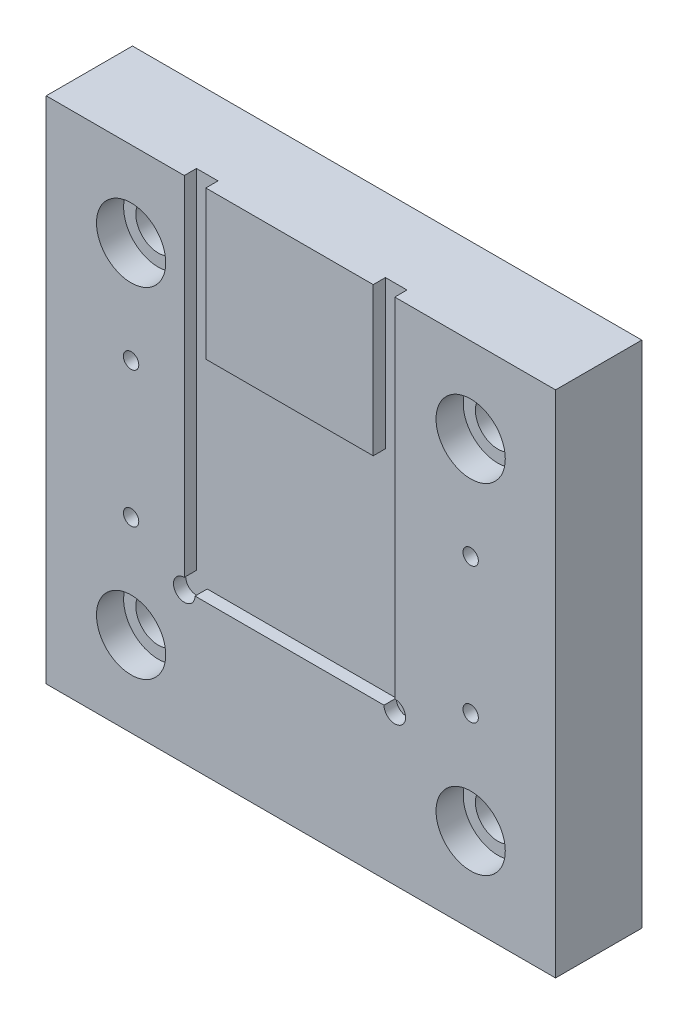
ISO-10303-21;
HEADER;
FILE_DESCRIPTION(('STEP AP214'),'2;1');
FILE_NAME('part.step','',(''),(''),'','','');
FILE_SCHEMA(('AUTOMOTIVE_DESIGN { 1 0 10303 214 1 1 1 1 }'));
ENDSEC;
DATA;
#1=APPLICATION_CONTEXT('core data for automotive mechanical design processes');
#2=APPLICATION_PROTOCOL_DEFINITION('international standard','automotive_design',2000,#1);
#3=PRODUCT_CONTEXT('',#1,'mechanical');
#4=PRODUCT('Part','Part','',(#3));
#5=PRODUCT_RELATED_PRODUCT_CATEGORY('part','',(#4));
#6=PRODUCT_DEFINITION_FORMATION('','',#4);
#7=PRODUCT_DEFINITION_CONTEXT('part definition',#1,'design');
#8=PRODUCT_DEFINITION('design','',#6,#7);
#9=PRODUCT_DEFINITION_SHAPE('','',#8);
#10=(LENGTH_UNIT() NAMED_UNIT(*) SI_UNIT(.MILLI.,.METRE.));
#11=(NAMED_UNIT(*) PLANE_ANGLE_UNIT() SI_UNIT($,.RADIAN.));
#12=(NAMED_UNIT(*) SI_UNIT($,.STERADIAN.) SOLID_ANGLE_UNIT());
#13=UNCERTAINTY_MEASURE_WITH_UNIT(LENGTH_MEASURE(1.E-05),#10,'distance_accuracy_value','');
#14=(GEOMETRIC_REPRESENTATION_CONTEXT(3) GLOBAL_UNCERTAINTY_ASSIGNED_CONTEXT((#13)) GLOBAL_UNIT_ASSIGNED_CONTEXT((#10,
#11,#12)) REPRESENTATION_CONTEXT('',''));
#15=CARTESIAN_POINT('',(0.,0.,0.));
#16=DIRECTION('',(0.,0.,1.));
#17=DIRECTION('',(1.,0.,0.));
#18=AXIS2_PLACEMENT_3D('',#15,#16,#17);
#19=CARTESIAN_POINT('',(0.,0.,12.7));
#20=DIRECTION('',(0.,0.,1.));
#21=DIRECTION('',(1.,0.,0.));
#22=AXIS2_PLACEMENT_3D('',#19,#20,#21);
#23=PLANE('',#22);
#24=DIRECTION('',(0.,1.,0.));
#25=VECTOR('',#24,1.);
#26=CARTESIAN_POINT('',(-49.6638269453301,39.1940373937284,12.7));
#27=LINE('',#26,#25);
#28=CARTESIAN_POINT('',(-49.6638269453301,39.1940373937284,12.7));
#29=VERTEX_POINT('',#28);
#30=CARTESIAN_POINT('',(-49.6638269453301,61.0294730285758,12.7));
#31=VERTEX_POINT('',#30);
#32=EDGE_CURVE('E155',#29,#31,#27,.T.);
#33=ORIENTED_EDGE('',*,*,#32,.F.);
#34=DIRECTION('',(-1.,0.,0.));
#35=VECTOR('',#34,1.);
#36=CARTESIAN_POINT('',(-49.6638269453301,39.1940373937284,12.7));
#37=LINE('',#36,#35);
#38=CARTESIAN_POINT('',(-25.0138269453301,39.1940373937284,12.7));
#39=VERTEX_POINT('',#38);
#40=EDGE_CURVE('E202',#39,#29,#37,.T.);
#41=ORIENTED_EDGE('',*,*,#40,.F.);
#42=DIRECTION('',(0.,-1.,0.));
#43=VECTOR('',#42,1.);
#44=CARTESIAN_POINT('',(-25.0138269453301,39.1940373937284,12.7));
#45=LINE('',#44,#43);
#46=CARTESIAN_POINT('',(-25.0138269453301,61.0294730285758,12.7));
#47=VERTEX_POINT('',#46);
#48=EDGE_CURVE('E199',#47,#39,#45,.T.);
#49=ORIENTED_EDGE('',*,*,#48,.F.);
#50=DIRECTION('',(-1.,0.,0.));
#51=VECTOR('',#50,1.);
#52=CARTESIAN_POINT('',(-73.1661572798309,61.0294730285758,12.7));
#53=LINE('',#52,#51);
#54=EDGE_CURVE('E293',#47,#31,#53,.T.);
#55=ORIENTED_EDGE('',*,*,#54,.T.);
#56=EDGE_LOOP('',(#33,#41,#49,#55));
#57=FACE_BOUND('',#56,.T.);
#58=ADVANCED_FACE('F32',(#57),#23,.T.);
#59=CARTESIAN_POINT('',(-10.6661572798309,-1.47052697142425,12.7));
#60=DIRECTION('',(0.,0.,-1.));
#61=DIRECTION('',(-1.,0.,0.));
#62=AXIS2_PLACEMENT_3D('',#59,#60,#61);
#63=CYLINDRICAL_SURFACE('',#62,3.3);
#64=CARTESIAN_POINT('',(-10.6661572798309,-1.47052697142425,0.));
#65=DIRECTION('',(0.,0.,1.));
#66=DIRECTION('',(1.,0.,0.));
#67=AXIS2_PLACEMENT_3D('',#64,#65,#66);
#68=CIRCLE('',#67,3.3);
#69=CARTESIAN_POINT('',(-7.36615727983086,-1.47052697142425,0.));
#70=VERTEX_POINT('',#69);
#71=EDGE_CURVE('E281',#70,#70,#68,.T.);
#72=ORIENTED_EDGE('',*,*,#71,.F.);
#73=EDGE_LOOP('',(#72));
#74=FACE_BOUND('',#73,.T.);
#75=CARTESIAN_POINT('',(-10.6661572798309,-1.47052697142425,8.7));
#76=DIRECTION('',(0.,0.,1.));
#77=DIRECTION('',(1.,0.,0.));
#78=AXIS2_PLACEMENT_3D('',#75,#76,#77);
#79=CIRCLE('',#78,3.3);
#80=CARTESIAN_POINT('',(-7.36615727983086,-1.47052697142425,8.7));
#81=VERTEX_POINT('',#80);
#82=EDGE_CURVE('E36',#81,#81,#79,.T.);
#83=ORIENTED_EDGE('',*,*,#82,.T.);
#84=EDGE_LOOP('',(#83));
#85=FACE_BOUND('',#84,.T.);
#86=ADVANCED_FACE('F368',(#74,#85),#63,.F.);
#87=CARTESIAN_POINT('',(-60.6661572798309,-1.47052697142424,12.7));
#88=DIRECTION('',(0.,0.,-1.));
#89=DIRECTION('',(-1.,0.,0.));
#90=AXIS2_PLACEMENT_3D('',#87,#88,#89);
#91=CYLINDRICAL_SURFACE('',#90,3.3);
#92=CARTESIAN_POINT('',(-60.6661572798309,-1.47052697142424,0.));
#93=DIRECTION('',(0.,0.,1.));
#94=DIRECTION('',(1.,0.,0.));
#95=AXIS2_PLACEMENT_3D('',#92,#93,#94);
#96=CIRCLE('',#95,3.3);
#97=CARTESIAN_POINT('',(-57.3661572798309,-1.47052697142424,0.));
#98=VERTEX_POINT('',#97);
#99=EDGE_CURVE('E284',#98,#98,#96,.T.);
#100=ORIENTED_EDGE('',*,*,#99,.F.);
#101=EDGE_LOOP('',(#100));
#102=FACE_BOUND('',#101,.T.);
#103=CARTESIAN_POINT('',(-60.6661572798309,-1.47052697142424,8.7));
#104=DIRECTION('',(0.,0.,1.));
#105=DIRECTION('',(1.,0.,0.));
#106=AXIS2_PLACEMENT_3D('',#103,#104,#105);
#107=CIRCLE('',#106,3.3);
#108=CARTESIAN_POINT('',(-57.3661572798309,-1.47052697142424,8.7));
#109=VERTEX_POINT('',#108);
#110=EDGE_CURVE('E233',#109,#109,#107,.T.);
#111=ORIENTED_EDGE('',*,*,#110,.T.);
#112=EDGE_LOOP('',(#111));
#113=FACE_BOUND('',#112,.T.);
#114=ADVANCED_FACE('F315',(#102,#113),#91,.F.);
#115=CARTESIAN_POINT('',(-10.6661572798309,48.5294730285758,12.7));
#116=DIRECTION('',(0.,0.,-1.));
#117=DIRECTION('',(-1.,0.,0.));
#118=AXIS2_PLACEMENT_3D('',#115,#116,#117);
#119=CYLINDRICAL_SURFACE('',#118,3.3);
#120=CARTESIAN_POINT('',(-10.6661572798309,48.5294730285758,0.));
#121=DIRECTION('',(0.,0.,1.));
#122=DIRECTION('',(1.,0.,0.));
#123=AXIS2_PLACEMENT_3D('',#120,#121,#122);
#124=CIRCLE('',#123,3.3);
#125=CARTESIAN_POINT('',(-7.36615727983088,48.5294730285758,0.));
#126=VERTEX_POINT('',#125);
#127=EDGE_CURVE('E278',#126,#126,#124,.T.);
#128=ORIENTED_EDGE('',*,*,#127,.F.);
#129=EDGE_LOOP('',(#128));
#130=FACE_BOUND('',#129,.T.);
#131=CARTESIAN_POINT('',(-10.6661572798309,48.5294730285758,8.7));
#132=DIRECTION('',(0.,0.,1.));
#133=DIRECTION('',(1.,0.,0.));
#134=AXIS2_PLACEMENT_3D('',#131,#132,#133);
#135=CIRCLE('',#134,3.3);
#136=CARTESIAN_POINT('',(-7.36615727983088,48.5294730285758,8.7));
#137=VERTEX_POINT('',#136);
#138=EDGE_CURVE('E240',#137,#137,#135,.T.);
#139=ORIENTED_EDGE('',*,*,#138,.T.);
#140=EDGE_LOOP('',(#139));
#141=FACE_BOUND('',#140,.T.);
#142=ADVANCED_FACE('F378',(#130,#141),#119,.F.);
#143=CARTESIAN_POINT('',(-60.6661572798309,48.5294730285758,12.7));
#144=DIRECTION('',(0.,0.,-1.));
#145=DIRECTION('',(-1.,0.,0.));
#146=AXIS2_PLACEMENT_3D('',#143,#144,#145);
#147=CYLINDRICAL_SURFACE('',#146,3.29999999999999);
#148=CARTESIAN_POINT('',(-60.6661572798309,48.5294730285758,0.));
#149=DIRECTION('',(0.,0.,1.));
#150=DIRECTION('',(1.,0.,0.));
#151=AXIS2_PLACEMENT_3D('',#148,#149,#150);
#152=CIRCLE('',#151,3.29999999999999);
#153=CARTESIAN_POINT('',(-57.3661572798309,48.5294730285758,0.));
#154=VERTEX_POINT('',#153);
#155=EDGE_CURVE('E273',#154,#154,#152,.T.);
#156=ORIENTED_EDGE('',*,*,#155,.F.);
#157=EDGE_LOOP('',(#156));
#158=FACE_BOUND('',#157,.T.);
#159=CARTESIAN_POINT('',(-60.6661572798309,48.5294730285758,8.7));
#160=DIRECTION('',(0.,0.,1.));
#161=DIRECTION('',(1.,0.,0.));
#162=AXIS2_PLACEMENT_3D('',#159,#160,#161);
#163=CIRCLE('',#162,3.29999999999999);
#164=CARTESIAN_POINT('',(-57.3661572798309,48.5294730285758,8.7));
#165=VERTEX_POINT('',#164);
#166=EDGE_CURVE('E247',#165,#165,#163,.T.);
#167=ORIENTED_EDGE('',*,*,#166,.T.);
#168=EDGE_LOOP('',(#167));
#169=FACE_BOUND('',#168,.T.);
#170=ADVANCED_FACE('F335',(#158,#169),#147,.F.);
#171=DIRECTION('',(0.,1.,0.));
#172=VECTOR('',#171,1.);
#173=CARTESIAN_POINT('',(-21.8388269453301,39.1940373937284,12.7));
#174=LINE('',#173,#172);
#175=CARTESIAN_POINT('',(-21.8388269453301,9.78153739372838,12.7));
#176=VERTEX_POINT('',#175);
#177=CARTESIAN_POINT('',(-21.8388269453301,61.0294730285758,12.7));
#178=VERTEX_POINT('',#177);
#179=EDGE_CURVE('E197',#176,#178,#174,.T.);
#180=ORIENTED_EDGE('',*,*,#179,.F.);
#181=CARTESIAN_POINT('',(-21.8388269453301,8.19403739372838,12.7));
#182=DIRECTION('',(0.,0.,1.));
#183=DIRECTION('',(1.,0.,0.));
#184=AXIS2_PLACEMENT_3D('',#181,#182,#183);
#185=CIRCLE('',#184,1.5875);
#186=CARTESIAN_POINT('',(-23.4263269453301,8.19403739372838,12.7));
#187=VERTEX_POINT('',#186);
#188=EDGE_CURVE('E194',#187,#176,#185,.T.);
#189=ORIENTED_EDGE('',*,*,#188,.F.);
#190=DIRECTION('',(1.,0.,0.));
#191=VECTOR('',#190,1.);
#192=CARTESIAN_POINT('',(-51.2513269453301,8.19403739372838,12.7));
#193=LINE('',#192,#191);
#194=CARTESIAN_POINT('',(-51.2513269453301,8.19403739372838,12.7));
#195=VERTEX_POINT('',#194);
#196=EDGE_CURVE('E191',#195,#187,#193,.T.);
#197=ORIENTED_EDGE('',*,*,#196,.F.);
#198=CARTESIAN_POINT('',(-52.8388269453301,8.19403739372838,12.7));
#199=DIRECTION('',(0.,0.,1.));
#200=DIRECTION('',(1.,0.,0.));
#201=AXIS2_PLACEMENT_3D('',#198,#199,#200);
#202=CIRCLE('',#201,1.5875);
#203=CARTESIAN_POINT('',(-52.8388269453301,9.78153739372838,12.7));
#204=VERTEX_POINT('',#203);
#205=EDGE_CURVE('E189',#204,#195,#202,.T.);
#206=ORIENTED_EDGE('',*,*,#205,.F.);
#207=DIRECTION('',(0.,-1.,0.));
#208=VECTOR('',#207,1.);
#209=CARTESIAN_POINT('',(-52.8388269453301,39.1940373937284,12.7));
#210=LINE('',#209,#208);
#211=CARTESIAN_POINT('',(-52.8388269453301,61.0294730285758,12.7));
#212=VERTEX_POINT('',#211);
#213=EDGE_CURVE('E161',#212,#204,#210,.T.);
#214=ORIENTED_EDGE('',*,*,#213,.F.);
#215=CARTESIAN_POINT('',(-73.1661572798309,61.0294730285758,12.7));
#216=VERTEX_POINT('',#215);
#217=EDGE_CURVE('E290',#212,#216,#53,.T.);
#218=ORIENTED_EDGE('',*,*,#217,.T.);
#219=DIRECTION('',(0.,-1.,0.));
#220=VECTOR('',#219,1.);
#221=CARTESIAN_POINT('',(-73.1661572798309,61.0294730285758,12.7));
#222=LINE('',#221,#220);
#223=CARTESIAN_POINT('',(-73.1661572798309,-13.9705269714242,12.7));
#224=VERTEX_POINT('',#223);
#225=EDGE_CURVE('E292',#216,#224,#222,.T.);
#226=ORIENTED_EDGE('',*,*,#225,.T.);
#227=DIRECTION('',(1.,0.,0.));
#228=VECTOR('',#227,1.);
#229=CARTESIAN_POINT('',(-73.1661572798309,-13.9705269714242,12.7));
#230=LINE('',#229,#228);
#231=CARTESIAN_POINT('',(1.83384272016913,-13.9705269714242,12.7));
#232=VERTEX_POINT('',#231);
#233=EDGE_CURVE('E58',#224,#232,#230,.T.);
#234=ORIENTED_EDGE('',*,*,#233,.T.);
#235=DIRECTION('',(0.,1.,0.));
#236=VECTOR('',#235,1.);
#237=CARTESIAN_POINT('',(1.83384272016912,61.0294730285758,12.7));
#238=LINE('',#237,#236);
#239=CARTESIAN_POINT('',(1.83384272016912,61.0294730285758,12.7));
#240=VERTEX_POINT('',#239);
#241=EDGE_CURVE('E288',#232,#240,#238,.T.);
#242=ORIENTED_EDGE('',*,*,#241,.T.);
#243=EDGE_CURVE('E86',#240,#178,#53,.T.);
#244=ORIENTED_EDGE('',*,*,#243,.T.);
#245=EDGE_LOOP('',(#180,#189,#197,#206,#214,#218,#226,#234,#242,#244));
#246=FACE_BOUND('',#245,.T.);
#247=CARTESIAN_POINT('',(-10.6661572798309,-1.47052697142425,12.7));
#248=DIRECTION('',(0.,0.,1.));
#249=DIRECTION('',(1.,0.,0.));
#250=AXIS2_PLACEMENT_3D('',#247,#248,#249);
#251=CIRCLE('',#250,5.1);
#252=CARTESIAN_POINT('',(-5.56615727983086,-1.47052697142425,12.7));
#253=VERTEX_POINT('',#252);
#254=EDGE_CURVE('E208',#253,#253,#251,.T.);
#255=ORIENTED_EDGE('',*,*,#254,.F.);
#256=EDGE_LOOP('',(#255));
#257=FACE_BOUND('',#256,.T.);
#258=CARTESIAN_POINT('',(-60.6661572798309,-1.47052697142424,12.7));
#259=DIRECTION('',(0.,0.,1.));
#260=DIRECTION('',(1.,0.,0.));
#261=AXIS2_PLACEMENT_3D('',#258,#259,#260);
#262=CIRCLE('',#261,5.1);
#263=CARTESIAN_POINT('',(-55.5661572798309,-1.47052697142424,12.7));
#264=VERTEX_POINT('',#263);
#265=EDGE_CURVE('E234',#264,#264,#262,.T.);
#266=ORIENTED_EDGE('',*,*,#265,.F.);
#267=EDGE_LOOP('',(#266));
#268=FACE_BOUND('',#267,.T.);
#269=CARTESIAN_POINT('',(-10.6661572798309,48.5294730285758,12.7));
#270=DIRECTION('',(0.,0.,1.));
#271=DIRECTION('',(1.,0.,0.));
#272=AXIS2_PLACEMENT_3D('',#269,#270,#271);
#273=CIRCLE('',#272,5.1);
#274=CARTESIAN_POINT('',(-5.56615727983088,48.5294730285758,12.7));
#275=VERTEX_POINT('',#274);
#276=EDGE_CURVE('E241',#275,#275,#273,.T.);
#277=ORIENTED_EDGE('',*,*,#276,.F.);
#278=EDGE_LOOP('',(#277));
#279=FACE_BOUND('',#278,.T.);
#280=CARTESIAN_POINT('',(-60.6661572798309,48.5294730285758,12.7));
#281=DIRECTION('',(0.,0.,1.));
#282=DIRECTION('',(1.,0.,0.));
#283=AXIS2_PLACEMENT_3D('',#280,#281,#282);
#284=CIRCLE('',#283,5.1);
#285=CARTESIAN_POINT('',(-55.5661572798309,48.5294730285758,12.7));
#286=VERTEX_POINT('',#285);
#287=EDGE_CURVE('E248',#286,#286,#284,.T.);
#288=ORIENTED_EDGE('',*,*,#287,.F.);
#289=EDGE_LOOP('',(#288));
#290=FACE_BOUND('',#289,.T.);
#291=CARTESIAN_POINT('',(-60.6661572798309,13.5294730285758,12.7));
#292=DIRECTION('',(0.,0.,1.));
#293=DIRECTION('',(1.,0.,0.));
#294=AXIS2_PLACEMENT_3D('',#291,#292,#293);
#295=CIRCLE('',#294,1.1303);
#296=CARTESIAN_POINT('',(-59.5358572798309,13.5294730285758,12.7));
#297=VERTEX_POINT('',#296);
#298=EDGE_CURVE('E258',#297,#297,#295,.T.);
#299=ORIENTED_EDGE('',*,*,#298,.F.);
#300=EDGE_LOOP('',(#299));
#301=FACE_BOUND('',#300,.T.);
#302=CARTESIAN_POINT('',(-60.6661572798309,33.5294730285758,12.7));
#303=DIRECTION('',(0.,0.,1.));
#304=DIRECTION('',(1.,0.,0.));
#305=AXIS2_PLACEMENT_3D('',#302,#303,#304);
#306=CIRCLE('',#305,1.1303);
#307=CARTESIAN_POINT('',(-59.5358572798309,33.5294730285758,12.7));
#308=VERTEX_POINT('',#307);
#309=EDGE_CURVE('E270',#308,#308,#306,.T.);
#310=ORIENTED_EDGE('',*,*,#309,.F.);
#311=EDGE_LOOP('',(#310));
#312=FACE_BOUND('',#311,.T.);
#313=CARTESIAN_POINT('',(-10.6661572798309,33.5294730285758,12.7));
#314=DIRECTION('',(0.,0.,1.));
#315=DIRECTION('',(1.,0.,0.));
#316=AXIS2_PLACEMENT_3D('',#313,#314,#315);
#317=CIRCLE('',#316,1.1303);
#318=CARTESIAN_POINT('',(-9.53585727983087,33.5294730285758,12.7));
#319=VERTEX_POINT('',#318);
#320=EDGE_CURVE('E264',#319,#319,#317,.T.);
#321=ORIENTED_EDGE('',*,*,#320,.F.);
#322=EDGE_LOOP('',(#321));
#323=FACE_BOUND('',#322,.T.);
#324=CARTESIAN_POINT('',(-10.6661572798309,13.5294730285758,12.7));
#325=DIRECTION('',(0.,0.,1.));
#326=DIRECTION('',(1.,0.,0.));
#327=AXIS2_PLACEMENT_3D('',#324,#325,#326);
#328=CIRCLE('',#327,1.1303);
#329=CARTESIAN_POINT('',(-9.53585727983087,13.5294730285758,12.7));
#330=VERTEX_POINT('',#329);
#331=EDGE_CURVE('E251',#330,#330,#328,.T.);
#332=ORIENTED_EDGE('',*,*,#331,.F.);
#333=EDGE_LOOP('',(#332));
#334=FACE_BOUND('',#333,.T.);
#335=ADVANCED_FACE('F331',(#246,#257,#268,#279,#290,#301,#312,#323,#334),#23,.T.);
#336=CARTESIAN_POINT('',(0.,0.,0.));
#337=DIRECTION('',(0.,0.,1.));
#338=DIRECTION('',(1.,0.,0.));
#339=AXIS2_PLACEMENT_3D('',#336,#337,#338);
#340=PLANE('',#339);
#341=CARTESIAN_POINT('',(-60.6661572798309,13.5294730285758,0.));
#342=DIRECTION('',(0.,0.,1.));
#343=DIRECTION('',(1.,0.,0.));
#344=AXIS2_PLACEMENT_3D('',#341,#342,#343);
#345=CIRCLE('',#344,1.1303);
#346=CARTESIAN_POINT('',(-59.5358572798309,13.5294730285758,0.));
#347=VERTEX_POINT('',#346);
#348=EDGE_CURVE('E254',#347,#347,#345,.T.);
#349=ORIENTED_EDGE('',*,*,#348,.T.);
#350=EDGE_LOOP('',(#349));
#351=FACE_BOUND('',#350,.T.);
#352=CARTESIAN_POINT('',(-60.6661572798309,33.5294730285758,0.));
#353=DIRECTION('',(0.,0.,1.));
#354=DIRECTION('',(1.,0.,0.));
#355=AXIS2_PLACEMENT_3D('',#352,#353,#354);
#356=CIRCLE('',#355,1.1303);
#357=CARTESIAN_POINT('',(-59.5358572798309,33.5294730285758,0.));
#358=VERTEX_POINT('',#357);
#359=EDGE_CURVE('E267',#358,#358,#356,.T.);
#360=ORIENTED_EDGE('',*,*,#359,.T.);
#361=EDGE_LOOP('',(#360));
#362=FACE_BOUND('',#361,.T.);
#363=ORIENTED_EDGE('',*,*,#127,.T.);
#364=EDGE_LOOP('',(#363));
#365=FACE_BOUND('',#364,.T.);
#366=ORIENTED_EDGE('',*,*,#99,.T.);
#367=EDGE_LOOP('',(#366));
#368=FACE_BOUND('',#367,.T.);
#369=DIRECTION('',(0.,1.,0.));
#370=VECTOR('',#369,1.);
#371=CARTESIAN_POINT('',(1.83384272016912,61.0294730285758,0.));
#372=LINE('',#371,#370);
#373=CARTESIAN_POINT('',(1.83384272016913,-13.9705269714242,0.));
#374=VERTEX_POINT('',#373);
#375=CARTESIAN_POINT('',(1.83384272016912,61.0294730285758,0.));
#376=VERTEX_POINT('',#375);
#377=EDGE_CURVE('E287',#374,#376,#372,.T.);
#378=ORIENTED_EDGE('',*,*,#377,.F.);
#379=DIRECTION('',(1.,0.,0.));
#380=VECTOR('',#379,1.);
#381=CARTESIAN_POINT('',(-73.1661572798309,-13.9705269714242,0.));
#382=LINE('',#381,#380);
#383=CARTESIAN_POINT('',(-73.1661572798309,-13.9705269714242,0.));
#384=VERTEX_POINT('',#383);
#385=EDGE_CURVE('E79',#384,#374,#382,.T.);
#386=ORIENTED_EDGE('',*,*,#385,.F.);
#387=DIRECTION('',(0.,-1.,0.));
#388=VECTOR('',#387,1.);
#389=CARTESIAN_POINT('',(-73.1661572798309,61.0294730285758,0.));
#390=LINE('',#389,#388);
#391=CARTESIAN_POINT('',(-73.1661572798309,61.0294730285758,0.));
#392=VERTEX_POINT('',#391);
#393=EDGE_CURVE('E301',#392,#384,#390,.T.);
#394=ORIENTED_EDGE('',*,*,#393,.F.);
#395=DIRECTION('',(-1.,0.,0.));
#396=VECTOR('',#395,1.);
#397=CARTESIAN_POINT('',(-73.1661572798309,61.0294730285758,0.));
#398=LINE('',#397,#396);
#399=EDGE_CURVE('E299',#376,#392,#398,.T.);
#400=ORIENTED_EDGE('',*,*,#399,.F.);
#401=EDGE_LOOP('',(#378,#386,#394,#400));
#402=FACE_BOUND('',#401,.T.);
#403=ORIENTED_EDGE('',*,*,#71,.T.);
#404=EDGE_LOOP('',(#403));
#405=FACE_BOUND('',#404,.T.);
#406=ORIENTED_EDGE('',*,*,#155,.T.);
#407=EDGE_LOOP('',(#406));
#408=FACE_BOUND('',#407,.T.);
#409=CARTESIAN_POINT('',(-10.6661572798309,33.5294730285758,0.));
#410=DIRECTION('',(0.,0.,1.));
#411=DIRECTION('',(1.,0.,0.));
#412=AXIS2_PLACEMENT_3D('',#409,#410,#411);
#413=CIRCLE('',#412,1.1303);
#414=CARTESIAN_POINT('',(-9.53585727983087,33.5294730285758,0.));
#415=VERTEX_POINT('',#414);
#416=EDGE_CURVE('E261',#415,#415,#413,.T.);
#417=ORIENTED_EDGE('',*,*,#416,.T.);
#418=EDGE_LOOP('',(#417));
#419=FACE_BOUND('',#418,.T.);
#420=CARTESIAN_POINT('',(-10.6661572798309,13.5294730285758,0.));
#421=DIRECTION('',(0.,0.,1.));
#422=DIRECTION('',(1.,0.,0.));
#423=AXIS2_PLACEMENT_3D('',#420,#421,#422);
#424=CIRCLE('',#423,1.1303);
#425=CARTESIAN_POINT('',(-9.53585727983087,13.5294730285758,0.));
#426=VERTEX_POINT('',#425);
#427=EDGE_CURVE('E255',#426,#426,#424,.T.);
#428=ORIENTED_EDGE('',*,*,#427,.T.);
#429=EDGE_LOOP('',(#428));
#430=FACE_BOUND('',#429,.T.);
#431=ADVANCED_FACE('F334',(#351,#362,#365,#368,#402,#405,#408,#419,#430),#340,.F.);
#432=CARTESIAN_POINT('',(1.83384272016912,61.0294730285758,12.7));
#433=DIRECTION('',(-1.,0.,0.));
#434=DIRECTION('',(0.,-1.,0.));
#435=AXIS2_PLACEMENT_3D('',#432,#433,#434);
#436=PLANE('',#435);
#437=ORIENTED_EDGE('',*,*,#377,.T.);
#438=DIRECTION('',(0.,0.,-1.));
#439=VECTOR('',#438,1.);
#440=CARTESIAN_POINT('',(1.83384272016912,61.0294730285758,12.7));
#441=LINE('',#440,#439);
#442=EDGE_CURVE('E11',#240,#376,#441,.T.);
#443=ORIENTED_EDGE('',*,*,#442,.F.);
#444=ORIENTED_EDGE('',*,*,#241,.F.);
#445=DIRECTION('',(0.,0.,-1.));
#446=VECTOR('',#445,1.);
#447=CARTESIAN_POINT('',(1.83384272016913,-13.9705269714242,12.7));
#448=LINE('',#447,#446);
#449=EDGE_CURVE('E296',#232,#374,#448,.T.);
#450=ORIENTED_EDGE('',*,*,#449,.T.);
#451=EDGE_LOOP('',(#437,#443,#444,#450));
#452=FACE_BOUND('',#451,.T.);
#453=ADVANCED_FACE('F34',(#452),#436,.F.);
#454=CARTESIAN_POINT('',(-73.1661572798309,61.0294730285758,12.7));
#455=DIRECTION('',(0.,-1.,0.));
#456=DIRECTION('',(0.,0.,-1.));
#457=AXIS2_PLACEMENT_3D('',#454,#455,#456);
#458=PLANE('',#457);
#459=ORIENTED_EDGE('',*,*,#54,.F.);
#460=DIRECTION('',(0.,0.,1.));
#461=VECTOR('',#460,1.);
#462=CARTESIAN_POINT('',(-25.0138269453301,61.0294730285758,10.9));
#463=LINE('',#462,#461);
#464=CARTESIAN_POINT('',(-25.0138269453301,61.0294730285758,10.9));
#465=VERTEX_POINT('',#464);
#466=EDGE_CURVE('E216',#465,#47,#463,.T.);
#467=ORIENTED_EDGE('',*,*,#466,.F.);
#468=DIRECTION('',(-1.,0.,0.));
#469=VECTOR('',#468,1.);
#470=CARTESIAN_POINT('',(-25.0138269453301,61.0294730285758,10.9));
#471=LINE('',#470,#469);
#472=CARTESIAN_POINT('',(-21.8388269453301,61.0294730285758,10.9));
#473=VERTEX_POINT('',#472);
#474=EDGE_CURVE('E178',#473,#465,#471,.T.);
#475=ORIENTED_EDGE('',*,*,#474,.F.);
#476=DIRECTION('',(0.,0.,1.));
#477=VECTOR('',#476,1.);
#478=CARTESIAN_POINT('',(-21.8388269453301,61.0294730285758,10.9));
#479=LINE('',#478,#477);
#480=EDGE_CURVE('E218',#473,#178,#479,.T.);
#481=ORIENTED_EDGE('',*,*,#480,.T.);
#482=ORIENTED_EDGE('',*,*,#243,.F.);
#483=ORIENTED_EDGE('',*,*,#442,.T.);
#484=ORIENTED_EDGE('',*,*,#399,.T.);
#485=DIRECTION('',(0.,0.,-1.));
#486=VECTOR('',#485,1.);
#487=CARTESIAN_POINT('',(-73.1661572798309,61.0294730285758,12.7));
#488=LINE('',#487,#486);
#489=EDGE_CURVE('E41',#216,#392,#488,.T.);
#490=ORIENTED_EDGE('',*,*,#489,.F.);
#491=ORIENTED_EDGE('',*,*,#217,.F.);
#492=DIRECTION('',(0.,0.,1.));
#493=VECTOR('',#492,1.);
#494=CARTESIAN_POINT('',(-52.8388269453301,61.0294730285758,10.9));
#495=LINE('',#494,#493);
#496=CARTESIAN_POINT('',(-52.8388269453301,61.0294730285758,10.9));
#497=VERTEX_POINT('',#496);
#498=EDGE_CURVE('E206',#497,#212,#495,.T.);
#499=ORIENTED_EDGE('',*,*,#498,.F.);
#500=DIRECTION('',(-1.,0.,0.));
#501=VECTOR('',#500,1.);
#502=CARTESIAN_POINT('',(-52.8388269453301,61.0294730285758,10.9));
#503=LINE('',#502,#501);
#504=CARTESIAN_POINT('',(-49.6638269453301,61.0294730285758,10.9));
#505=VERTEX_POINT('',#504);
#506=EDGE_CURVE('E152',#505,#497,#503,.T.);
#507=ORIENTED_EDGE('',*,*,#506,.F.);
#508=DIRECTION('',(0.,0.,1.));
#509=VECTOR('',#508,1.);
#510=CARTESIAN_POINT('',(-49.6638269453301,61.0294730285758,10.9));
#511=LINE('',#510,#509);
#512=EDGE_CURVE('E209',#505,#31,#511,.T.);
#513=ORIENTED_EDGE('',*,*,#512,.T.);
#514=EDGE_LOOP('',(#459,#467,#475,#481,#482,#483,#484,#490,#491,#499,#507,#513));
#515=FACE_BOUND('',#514,.T.);
#516=ADVANCED_FACE('F363',(#515),#458,.F.);
#517=CARTESIAN_POINT('',(-73.1661572798309,61.0294730285758,12.7));
#518=DIRECTION('',(1.,0.,0.));
#519=DIRECTION('',(0.,1.,0.));
#520=AXIS2_PLACEMENT_3D('',#517,#518,#519);
#521=PLANE('',#520);
#522=ORIENTED_EDGE('',*,*,#393,.T.);
#523=DIRECTION('',(0.,0.,-1.));
#524=VECTOR('',#523,1.);
#525=CARTESIAN_POINT('',(-73.1661572798309,-13.9705269714242,12.7));
#526=LINE('',#525,#524);
#527=EDGE_CURVE('E305',#224,#384,#526,.T.);
#528=ORIENTED_EDGE('',*,*,#527,.F.);
#529=ORIENTED_EDGE('',*,*,#225,.F.);
#530=ORIENTED_EDGE('',*,*,#489,.T.);
#531=EDGE_LOOP('',(#522,#528,#529,#530));
#532=FACE_BOUND('',#531,.T.);
#533=ADVANCED_FACE('F540',(#532),#521,.F.);
#534=CARTESIAN_POINT('',(-73.1661572798309,-13.9705269714242,12.7));
#535=DIRECTION('',(0.,1.,0.));
#536=DIRECTION('',(0.,0.,1.));
#537=AXIS2_PLACEMENT_3D('',#534,#535,#536);
#538=PLANE('',#537);
#539=ORIENTED_EDGE('',*,*,#385,.T.);
#540=ORIENTED_EDGE('',*,*,#449,.F.);
#541=ORIENTED_EDGE('',*,*,#233,.F.);
#542=ORIENTED_EDGE('',*,*,#527,.T.);
#543=EDGE_LOOP('',(#539,#540,#541,#542));
#544=FACE_BOUND('',#543,.T.);
#545=ADVANCED_FACE('F391',(#544),#538,.F.);
#546=CARTESIAN_POINT('',(-60.6661572798309,33.5294730285758,12.7));
#547=DIRECTION('',(0.,0.,-1.));
#548=DIRECTION('',(-1.,0.,0.));
#549=AXIS2_PLACEMENT_3D('',#546,#547,#548);
#550=CYLINDRICAL_SURFACE('',#549,1.1303);
#551=ORIENTED_EDGE('',*,*,#309,.T.);
#552=EDGE_LOOP('',(#551));
#553=FACE_BOUND('',#552,.T.);
#554=ORIENTED_EDGE('',*,*,#359,.F.);
#555=EDGE_LOOP('',(#554));
#556=FACE_BOUND('',#555,.T.);
#557=ADVANCED_FACE('F387',(#553,#556),#550,.F.);
#558=CARTESIAN_POINT('',(-10.6661572798309,33.5294730285758,12.7));
#559=DIRECTION('',(0.,0.,-1.));
#560=DIRECTION('',(-1.,0.,0.));
#561=AXIS2_PLACEMENT_3D('',#558,#559,#560);
#562=CYLINDRICAL_SURFACE('',#561,1.1303);
#563=ORIENTED_EDGE('',*,*,#320,.T.);
#564=EDGE_LOOP('',(#563));
#565=FACE_BOUND('',#564,.T.);
#566=ORIENTED_EDGE('',*,*,#416,.F.);
#567=EDGE_LOOP('',(#566));
#568=FACE_BOUND('',#567,.T.);
#569=ADVANCED_FACE('F390',(#565,#568),#562,.F.);
#570=CARTESIAN_POINT('',(-60.6661572798309,13.5294730285758,12.7));
#571=DIRECTION('',(0.,0.,-1.));
#572=DIRECTION('',(-1.,0.,0.));
#573=AXIS2_PLACEMENT_3D('',#570,#571,#572);
#574=CYLINDRICAL_SURFACE('',#573,1.1303);
#575=ORIENTED_EDGE('',*,*,#298,.T.);
#576=EDGE_LOOP('',(#575));
#577=FACE_BOUND('',#576,.T.);
#578=ORIENTED_EDGE('',*,*,#348,.F.);
#579=EDGE_LOOP('',(#578));
#580=FACE_BOUND('',#579,.T.);
#581=ADVANCED_FACE('F353',(#577,#580),#574,.F.);
#582=CARTESIAN_POINT('',(-10.6661572798309,13.5294730285758,12.7));
#583=DIRECTION('',(0.,0.,-1.));
#584=DIRECTION('',(-1.,0.,0.));
#585=AXIS2_PLACEMENT_3D('',#582,#583,#584);
#586=CYLINDRICAL_SURFACE('',#585,1.1303);
#587=ORIENTED_EDGE('',*,*,#331,.T.);
#588=EDGE_LOOP('',(#587));
#589=FACE_BOUND('',#588,.T.);
#590=ORIENTED_EDGE('',*,*,#427,.F.);
#591=EDGE_LOOP('',(#590));
#592=FACE_BOUND('',#591,.T.);
#593=ADVANCED_FACE('F349',(#589,#592),#586,.F.);
#594=CARTESIAN_POINT('',(-60.6661572798309,48.5294730285758,8.7));
#595=DIRECTION('',(0.,0.,1.));
#596=DIRECTION('',(1.,0.,0.));
#597=AXIS2_PLACEMENT_3D('',#594,#595,#596);
#598=CYLINDRICAL_SURFACE('',#597,5.1);
#599=CARTESIAN_POINT('',(-60.6661572798309,48.5294730285758,8.7));
#600=DIRECTION('',(0.,0.,1.));
#601=DIRECTION('',(1.,0.,0.));
#602=AXIS2_PLACEMENT_3D('',#599,#600,#601);
#603=CIRCLE('',#602,5.1);
#604=CARTESIAN_POINT('',(-55.5661572798309,48.5294730285758,8.7));
#605=VERTEX_POINT('',#604);
#606=EDGE_CURVE('E244',#605,#605,#603,.T.);
#607=ORIENTED_EDGE('',*,*,#606,.F.);
#608=EDGE_LOOP('',(#607));
#609=FACE_BOUND('',#608,.T.);
#610=ORIENTED_EDGE('',*,*,#287,.T.);
#611=EDGE_LOOP('',(#610));
#612=FACE_BOUND('',#611,.T.);
#613=ADVANCED_FACE('F352',(#609,#612),#598,.F.);
#614=CARTESIAN_POINT('',(-60.6661572798309,48.5294730285758,8.7));
#615=DIRECTION('',(0.,0.,1.));
#616=DIRECTION('',(1.,0.,0.));
#617=AXIS2_PLACEMENT_3D('',#614,#615,#616);
#618=PLANE('',#617);
#619=ORIENTED_EDGE('',*,*,#166,.F.);
#620=EDGE_LOOP('',(#619));
#621=FACE_BOUND('',#620,.T.);
#622=ORIENTED_EDGE('',*,*,#606,.T.);
#623=EDGE_LOOP('',(#622));
#624=FACE_BOUND('',#623,.T.);
#625=ADVANCED_FACE('F401',(#621,#624),#618,.T.);
#626=CARTESIAN_POINT('',(-10.6661572798309,48.5294730285758,8.7));
#627=DIRECTION('',(0.,0.,1.));
#628=DIRECTION('',(1.,0.,0.));
#629=AXIS2_PLACEMENT_3D('',#626,#627,#628);
#630=CYLINDRICAL_SURFACE('',#629,5.1);
#631=CARTESIAN_POINT('',(-10.6661572798309,48.5294730285758,8.7));
#632=DIRECTION('',(0.,0.,1.));
#633=DIRECTION('',(1.,0.,0.));
#634=AXIS2_PLACEMENT_3D('',#631,#632,#633);
#635=CIRCLE('',#634,5.1);
#636=CARTESIAN_POINT('',(-5.56615727983088,48.5294730285758,8.7));
#637=VERTEX_POINT('',#636);
#638=EDGE_CURVE('E237',#637,#637,#635,.T.);
#639=ORIENTED_EDGE('',*,*,#638,.F.);
#640=EDGE_LOOP('',(#639));
#641=FACE_BOUND('',#640,.T.);
#642=ORIENTED_EDGE('',*,*,#276,.T.);
#643=EDGE_LOOP('',(#642));
#644=FACE_BOUND('',#643,.T.);
#645=ADVANCED_FACE('F405',(#641,#644),#630,.F.);
#646=CARTESIAN_POINT('',(-10.6661572798309,48.5294730285758,8.7));
#647=DIRECTION('',(0.,0.,1.));
#648=DIRECTION('',(1.,0.,0.));
#649=AXIS2_PLACEMENT_3D('',#646,#647,#648);
#650=PLANE('',#649);
#651=ORIENTED_EDGE('',*,*,#138,.F.);
#652=EDGE_LOOP('',(#651));
#653=FACE_BOUND('',#652,.T.);
#654=ORIENTED_EDGE('',*,*,#638,.T.);
#655=EDGE_LOOP('',(#654));
#656=FACE_BOUND('',#655,.T.);
#657=ADVANCED_FACE('F327',(#653,#656),#650,.T.);
#658=CARTESIAN_POINT('',(-60.6661572798309,-1.47052697142424,8.7));
#659=DIRECTION('',(0.,0.,1.));
#660=DIRECTION('',(1.,0.,0.));
#661=AXIS2_PLACEMENT_3D('',#658,#659,#660);
#662=CYLINDRICAL_SURFACE('',#661,5.1);
#663=CARTESIAN_POINT('',(-60.6661572798309,-1.47052697142424,8.7));
#664=DIRECTION('',(0.,0.,1.));
#665=DIRECTION('',(1.,0.,0.));
#666=AXIS2_PLACEMENT_3D('',#663,#664,#665);
#667=CIRCLE('',#666,5.1);
#668=CARTESIAN_POINT('',(-55.5661572798309,-1.47052697142424,8.7));
#669=VERTEX_POINT('',#668);
#670=EDGE_CURVE('E230',#669,#669,#667,.T.);
#671=ORIENTED_EDGE('',*,*,#670,.F.);
#672=EDGE_LOOP('',(#671));
#673=FACE_BOUND('',#672,.T.);
#674=ORIENTED_EDGE('',*,*,#265,.T.);
#675=EDGE_LOOP('',(#674));
#676=FACE_BOUND('',#675,.T.);
#677=ADVANCED_FACE('F321',(#673,#676),#662,.F.);
#678=CARTESIAN_POINT('',(-60.6661572798309,-1.47052697142424,8.7));
#679=DIRECTION('',(0.,0.,1.));
#680=DIRECTION('',(1.,0.,0.));
#681=AXIS2_PLACEMENT_3D('',#678,#679,#680);
#682=PLANE('',#681);
#683=ORIENTED_EDGE('',*,*,#110,.F.);
#684=EDGE_LOOP('',(#683));
#685=FACE_BOUND('',#684,.T.);
#686=ORIENTED_EDGE('',*,*,#670,.T.);
#687=EDGE_LOOP('',(#686));
#688=FACE_BOUND('',#687,.T.);
#689=ADVANCED_FACE('F317',(#685,#688),#682,.T.);
#690=CARTESIAN_POINT('',(-10.6661572798309,-1.47052697142425,8.7));
#691=DIRECTION('',(0.,0.,1.));
#692=DIRECTION('',(1.,0.,0.));
#693=AXIS2_PLACEMENT_3D('',#690,#691,#692);
#694=CYLINDRICAL_SURFACE('',#693,5.1);
#695=CARTESIAN_POINT('',(-10.6661572798309,-1.47052697142425,8.7));
#696=DIRECTION('',(0.,0.,1.));
#697=DIRECTION('',(1.,0.,0.));
#698=AXIS2_PLACEMENT_3D('',#695,#696,#697);
#699=CIRCLE('',#698,5.1);
#700=CARTESIAN_POINT('',(-5.56615727983086,-1.47052697142425,8.7));
#701=VERTEX_POINT('',#700);
#702=EDGE_CURVE('E225',#701,#701,#699,.T.);
#703=ORIENTED_EDGE('',*,*,#702,.F.);
#704=EDGE_LOOP('',(#703));
#705=FACE_BOUND('',#704,.T.);
#706=ORIENTED_EDGE('',*,*,#254,.T.);
#707=EDGE_LOOP('',(#706));
#708=FACE_BOUND('',#707,.T.);
#709=ADVANCED_FACE('F320',(#705,#708),#694,.F.);
#710=CARTESIAN_POINT('',(-10.6661572798309,-1.47052697142425,8.7));
#711=DIRECTION('',(0.,0.,1.));
#712=DIRECTION('',(1.,0.,0.));
#713=AXIS2_PLACEMENT_3D('',#710,#711,#712);
#714=PLANE('',#713);
#715=ORIENTED_EDGE('',*,*,#82,.F.);
#716=EDGE_LOOP('',(#715));
#717=FACE_BOUND('',#716,.T.);
#718=ORIENTED_EDGE('',*,*,#702,.T.);
#719=EDGE_LOOP('',(#718));
#720=FACE_BOUND('',#719,.T.);
#721=ADVANCED_FACE('F415',(#717,#720),#714,.T.);
#722=CARTESIAN_POINT('',(-49.6638269453301,39.1940373937284,10.9));
#723=DIRECTION('',(1.,0.,0.));
#724=DIRECTION('',(0.,0.,-1.));
#725=AXIS2_PLACEMENT_3D('',#722,#723,#724);
#726=PLANE('',#725);
#727=ORIENTED_EDGE('',*,*,#32,.T.);
#728=ORIENTED_EDGE('',*,*,#512,.F.);
#729=DIRECTION('',(0.,1.,0.));
#730=VECTOR('',#729,1.);
#731=CARTESIAN_POINT('',(-49.6638269453301,39.1940373937284,10.9));
#732=LINE('',#731,#730);
#733=CARTESIAN_POINT('',(-49.6638269453301,39.1940373937284,10.9));
#734=VERTEX_POINT('',#733);
#735=EDGE_CURVE('E49',#734,#505,#732,.T.);
#736=ORIENTED_EDGE('',*,*,#735,.F.);
#737=DIRECTION('',(0.,0.,1.));
#738=VECTOR('',#737,1.);
#739=CARTESIAN_POINT('',(-49.6638269453301,39.1940373937284,10.9));
#740=LINE('',#739,#738);
#741=EDGE_CURVE('E212',#734,#29,#740,.T.);
#742=ORIENTED_EDGE('',*,*,#741,.T.);
#743=EDGE_LOOP('',(#727,#728,#736,#742));
#744=FACE_BOUND('',#743,.T.);
#745=ADVANCED_FACE('F419',(#744),#726,.F.);
#746=CARTESIAN_POINT('',(-49.6638269453301,39.1940373937284,10.9));
#747=DIRECTION('',(0.,1.,0.));
#748=DIRECTION('',(0.,0.,1.));
#749=AXIS2_PLACEMENT_3D('',#746,#747,#748);
#750=PLANE('',#749);
#751=ORIENTED_EDGE('',*,*,#40,.T.);
#752=ORIENTED_EDGE('',*,*,#741,.F.);
#753=DIRECTION('',(-1.,0.,0.));
#754=VECTOR('',#753,1.);
#755=CARTESIAN_POINT('',(-49.6638269453301,39.1940373937284,10.9));
#756=LINE('',#755,#754);
#757=CARTESIAN_POINT('',(-25.0138269453301,39.1940373937284,10.9));
#758=VERTEX_POINT('',#757);
#759=EDGE_CURVE('E184',#758,#734,#756,.T.);
#760=ORIENTED_EDGE('',*,*,#759,.F.);
#761=DIRECTION('',(0.,0.,1.));
#762=VECTOR('',#761,1.);
#763=CARTESIAN_POINT('',(-25.0138269453301,39.1940373937284,10.9));
#764=LINE('',#763,#762);
#765=EDGE_CURVE('E214',#758,#39,#764,.T.);
#766=ORIENTED_EDGE('',*,*,#765,.T.);
#767=EDGE_LOOP('',(#751,#752,#760,#766));
#768=FACE_BOUND('',#767,.T.);
#769=ADVANCED_FACE('F440',(#768),#750,.F.);
#770=CARTESIAN_POINT('',(-25.0138269453301,39.1940373937284,10.9));
#771=DIRECTION('',(-1.,0.,0.));
#772=DIRECTION('',(0.,0.,1.));
#773=AXIS2_PLACEMENT_3D('',#770,#771,#772);
#774=PLANE('',#773);
#775=ORIENTED_EDGE('',*,*,#48,.T.);
#776=ORIENTED_EDGE('',*,*,#765,.F.);
#777=DIRECTION('',(0.,-1.,0.));
#778=VECTOR('',#777,1.);
#779=CARTESIAN_POINT('',(-25.0138269453301,39.1940373937284,10.9));
#780=LINE('',#779,#778);
#781=EDGE_CURVE('E181',#465,#758,#780,.T.);
#782=ORIENTED_EDGE('',*,*,#781,.F.);
#783=ORIENTED_EDGE('',*,*,#466,.T.);
#784=EDGE_LOOP('',(#775,#776,#782,#783));
#785=FACE_BOUND('',#784,.T.);
#786=ADVANCED_FACE('F436',(#785),#774,.F.);
#787=CARTESIAN_POINT('',(-21.8388269453301,39.1940373937284,10.9));
#788=DIRECTION('',(1.,0.,0.));
#789=DIRECTION('',(0.,0.,-1.));
#790=AXIS2_PLACEMENT_3D('',#787,#788,#789);
#791=PLANE('',#790);
#792=ORIENTED_EDGE('',*,*,#179,.T.);
#793=ORIENTED_EDGE('',*,*,#480,.F.);
#794=DIRECTION('',(0.,1.,0.));
#795=VECTOR('',#794,1.);
#796=CARTESIAN_POINT('',(-21.8388269453301,39.1940373937284,10.9));
#797=LINE('',#796,#795);
#798=CARTESIAN_POINT('',(-21.8388269453301,9.78153739372838,10.9));
#799=VERTEX_POINT('',#798);
#800=EDGE_CURVE('E176',#799,#473,#797,.T.);
#801=ORIENTED_EDGE('',*,*,#800,.F.);
#802=DIRECTION('',(0.,0.,1.));
#803=VECTOR('',#802,1.);
#804=CARTESIAN_POINT('',(-21.8388269453301,9.78153739372838,10.9));
#805=LINE('',#804,#803);
#806=EDGE_CURVE('E220',#799,#176,#805,.T.);
#807=ORIENTED_EDGE('',*,*,#806,.T.);
#808=EDGE_LOOP('',(#792,#793,#801,#807));
#809=FACE_BOUND('',#808,.T.);
#810=ADVANCED_FACE('F432',(#809),#791,.F.);
#811=CARTESIAN_POINT('',(-21.8388269453301,8.19403739372838,10.9));
#812=DIRECTION('',(0.,0.,1.));
#813=DIRECTION('',(1.,0.,0.));
#814=AXIS2_PLACEMENT_3D('',#811,#812,#813);
#815=CYLINDRICAL_SURFACE('',#814,1.5875);
#816=ORIENTED_EDGE('',*,*,#188,.T.);
#817=ORIENTED_EDGE('',*,*,#806,.F.);
#818=CARTESIAN_POINT('',(-21.8388269453301,8.19403739372838,10.9));
#819=DIRECTION('',(0.,0.,1.));
#820=DIRECTION('',(1.,0.,0.));
#821=AXIS2_PLACEMENT_3D('',#818,#819,#820);
#822=CIRCLE('',#821,1.5875);
#823=CARTESIAN_POINT('',(-23.4263269453301,8.19403739372838,10.9));
#824=VERTEX_POINT('',#823);
#825=EDGE_CURVE('E171',#824,#799,#822,.T.);
#826=ORIENTED_EDGE('',*,*,#825,.F.);
#827=DIRECTION('',(0.,0.,1.));
#828=VECTOR('',#827,1.);
#829=CARTESIAN_POINT('',(-23.4263269453301,8.19403739372838,10.9));
#830=LINE('',#829,#828);
#831=EDGE_CURVE('E222',#824,#187,#830,.T.);
#832=ORIENTED_EDGE('',*,*,#831,.T.);
#833=EDGE_LOOP('',(#816,#817,#826,#832));
#834=FACE_BOUND('',#833,.T.);
#835=ADVANCED_FACE('F428',(#834),#815,.F.);
#836=CARTESIAN_POINT('',(-51.2513269453301,8.19403739372838,10.9));
#837=DIRECTION('',(0.,-1.,0.));
#838=DIRECTION('',(0.,0.,-1.));
#839=AXIS2_PLACEMENT_3D('',#836,#837,#838);
#840=PLANE('',#839);
#841=ORIENTED_EDGE('',*,*,#196,.T.);
#842=ORIENTED_EDGE('',*,*,#831,.F.);
#843=DIRECTION('',(1.,0.,0.));
#844=VECTOR('',#843,1.);
#845=CARTESIAN_POINT('',(-51.2513269453301,8.19403739372838,10.9));
#846=LINE('',#845,#844);
#847=CARTESIAN_POINT('',(-51.2513269453301,8.19403739372838,10.9));
#848=VERTEX_POINT('',#847);
#849=EDGE_CURVE('E169',#848,#824,#846,.T.);
#850=ORIENTED_EDGE('',*,*,#849,.F.);
#851=DIRECTION('',(0.,0.,1.));
#852=VECTOR('',#851,1.);
#853=CARTESIAN_POINT('',(-51.2513269453301,8.19403739372838,10.9));
#854=LINE('',#853,#852);
#855=EDGE_CURVE('E165',#848,#195,#854,.T.);
#856=ORIENTED_EDGE('',*,*,#855,.T.);
#857=EDGE_LOOP('',(#841,#842,#850,#856));
#858=FACE_BOUND('',#857,.T.);
#859=ADVANCED_FACE('F425',(#858),#840,.F.);
#860=CARTESIAN_POINT('',(-52.8388269453301,8.19403739372838,10.9));
#861=DIRECTION('',(0.,0.,1.));
#862=DIRECTION('',(1.,0.,0.));
#863=AXIS2_PLACEMENT_3D('',#860,#861,#862);
#864=CYLINDRICAL_SURFACE('',#863,1.5875);
#865=ORIENTED_EDGE('',*,*,#205,.T.);
#866=ORIENTED_EDGE('',*,*,#855,.F.);
#867=CARTESIAN_POINT('',(-52.8388269453301,8.19403739372838,10.9));
#868=DIRECTION('',(0.,0.,1.));
#869=DIRECTION('',(1.,0.,0.));
#870=AXIS2_PLACEMENT_3D('',#867,#868,#869);
#871=CIRCLE('',#870,1.5875);
#872=CARTESIAN_POINT('',(-52.8388269453301,9.78153739372838,10.9));
#873=VERTEX_POINT('',#872);
#874=EDGE_CURVE('E150',#873,#848,#871,.T.);
#875=ORIENTED_EDGE('',*,*,#874,.F.);
#876=DIRECTION('',(0.,0.,1.));
#877=VECTOR('',#876,1.);
#878=CARTESIAN_POINT('',(-52.8388269453301,9.78153739372838,10.9));
#879=LINE('',#878,#877);
#880=EDGE_CURVE('E158',#873,#204,#879,.T.);
#881=ORIENTED_EDGE('',*,*,#880,.T.);
#882=EDGE_LOOP('',(#865,#866,#875,#881));
#883=FACE_BOUND('',#882,.T.);
#884=ADVANCED_FACE('F167',(#883),#864,.F.);
#885=CARTESIAN_POINT('',(-52.8388269453301,39.1940373937284,10.9));
#886=DIRECTION('',(-1.,0.,0.));
#887=DIRECTION('',(0.,0.,1.));
#888=AXIS2_PLACEMENT_3D('',#885,#886,#887);
#889=PLANE('',#888);
#890=ORIENTED_EDGE('',*,*,#213,.T.);
#891=ORIENTED_EDGE('',*,*,#880,.F.);
#892=DIRECTION('',(0.,-1.,0.));
#893=VECTOR('',#892,1.);
#894=CARTESIAN_POINT('',(-52.8388269453301,39.1940373937284,10.9));
#895=LINE('',#894,#893);
#896=EDGE_CURVE('E145',#497,#873,#895,.T.);
#897=ORIENTED_EDGE('',*,*,#896,.F.);
#898=ORIENTED_EDGE('',*,*,#498,.T.);
#899=EDGE_LOOP('',(#890,#891,#897,#898));
#900=FACE_BOUND('',#899,.T.);
#901=ADVANCED_FACE('F159',(#900),#889,.F.);
#902=CARTESIAN_POINT('',(-21.8388269453301,8.19403739372838,10.9));
#903=DIRECTION('',(0.,0.,1.));
#904=DIRECTION('',(1.,0.,0.));
#905=AXIS2_PLACEMENT_3D('',#902,#903,#904);
#906=PLANE('',#905);
#907=ORIENTED_EDGE('',*,*,#896,.T.);
#908=ORIENTED_EDGE('',*,*,#874,.T.);
#909=ORIENTED_EDGE('',*,*,#849,.T.);
#910=ORIENTED_EDGE('',*,*,#825,.T.);
#911=ORIENTED_EDGE('',*,*,#800,.T.);
#912=ORIENTED_EDGE('',*,*,#474,.T.);
#913=ORIENTED_EDGE('',*,*,#781,.T.);
#914=ORIENTED_EDGE('',*,*,#759,.T.);
#915=ORIENTED_EDGE('',*,*,#735,.T.);
#916=ORIENTED_EDGE('',*,*,#506,.T.);
#917=EDGE_LOOP('',(#907,#908,#909,#910,#911,#912,#913,#914,#915,#916));
#918=FACE_BOUND('',#917,.T.);
#919=ADVANCED_FACE('F147',(#918),#906,.T.);
#920=CLOSED_SHELL('',(#58,#86,#114,#142,#170,#335,#431,#453,#516,#533,#545,#557,#569,#581,#593,
#613,#625,#645,#657,#677,#689,#709,#721,#745,#769,#786,#810,#835,#859,#884,#901,#919));
#921=MANIFOLD_SOLID_BREP('B2',#920);
#922=ADVANCED_BREP_SHAPE_REPRESENTATION('',(#18,#921),#14);
#923=SHAPE_DEFINITION_REPRESENTATION(#9,#922);
ENDSEC;
END-ISO-10303-21;
